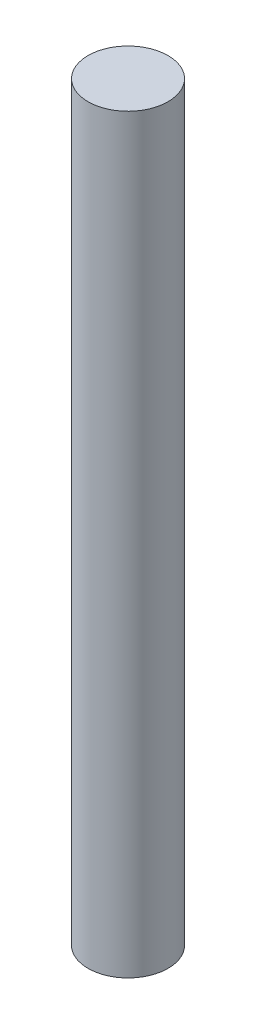
ISO-10303-21;
HEADER;
FILE_DESCRIPTION(('STEP AP214'),'2;1');
FILE_NAME('part.step','',(''),(''),'','','');
FILE_SCHEMA(('AUTOMOTIVE_DESIGN { 1 0 10303 214 1 1 1 1 }'));
ENDSEC;
DATA;
#1=APPLICATION_CONTEXT('core data for automotive mechanical design processes');
#2=APPLICATION_PROTOCOL_DEFINITION('international standard','automotive_design',2000,#1);
#3=PRODUCT_CONTEXT('',#1,'mechanical');
#4=PRODUCT('Part','Part','',(#3));
#5=PRODUCT_RELATED_PRODUCT_CATEGORY('part','',(#4));
#6=PRODUCT_DEFINITION_FORMATION('','',#4);
#7=PRODUCT_DEFINITION_CONTEXT('part definition',#1,'design');
#8=PRODUCT_DEFINITION('design','',#6,#7);
#9=PRODUCT_DEFINITION_SHAPE('','',#8);
#10=(LENGTH_UNIT() NAMED_UNIT(*) SI_UNIT(.MILLI.,.METRE.));
#11=(NAMED_UNIT(*) PLANE_ANGLE_UNIT() SI_UNIT($,.RADIAN.));
#12=(NAMED_UNIT(*) SI_UNIT($,.STERADIAN.) SOLID_ANGLE_UNIT());
#13=UNCERTAINTY_MEASURE_WITH_UNIT(LENGTH_MEASURE(1.E-05),#10,'distance_accuracy_value','');
#14=(GEOMETRIC_REPRESENTATION_CONTEXT(3) GLOBAL_UNCERTAINTY_ASSIGNED_CONTEXT((#13)) GLOBAL_UNIT_ASSIGNED_CONTEXT((#10,
#11,#12)) REPRESENTATION_CONTEXT('',''));
#15=CARTESIAN_POINT('',(0.,0.,0.));
#16=DIRECTION('',(0.,0.,1.));
#17=DIRECTION('',(1.,0.,0.));
#18=AXIS2_PLACEMENT_3D('',#15,#16,#17);
#19=CARTESIAN_POINT('',(0.,-7.6,0.));
#20=DIRECTION('',(0.,1.,0.));
#21=DIRECTION('',(0.,0.,1.));
#22=AXIS2_PLACEMENT_3D('',#19,#20,#21);
#23=PLANE('',#22);
#24=CARTESIAN_POINT('',(0.,-7.6,0.));
#25=DIRECTION('',(0.,-1.,0.));
#26=DIRECTION('',(0.,0.,-1.));
#27=AXIS2_PLACEMENT_3D('',#24,#25,#26);
#28=CIRCLE('',#27,0.405);
#29=CARTESIAN_POINT('',(0.,-7.6,-0.405));
#30=VERTEX_POINT('',#29);
#31=EDGE_CURVE('E17',#30,#30,#28,.F.);
#32=ORIENTED_EDGE('',*,*,#31,.F.);
#33=EDGE_LOOP('',(#32));
#34=FACE_BOUND('',#33,.T.);
#35=ADVANCED_FACE('F14',(#34),#23,.F.);
#36=CARTESIAN_POINT('',(0.,0.,0.));
#37=DIRECTION('',(0.,1.,0.));
#38=DIRECTION('',(0.,0.,1.));
#39=AXIS2_PLACEMENT_3D('',#36,#37,#38);
#40=PLANE('',#39);
#41=CARTESIAN_POINT('',(0.,0.,0.));
#42=DIRECTION('',(0.,-1.,0.));
#43=DIRECTION('',(0.,0.,-1.));
#44=AXIS2_PLACEMENT_3D('',#41,#42,#43);
#45=CIRCLE('',#44,0.405);
#46=CARTESIAN_POINT('',(0.,0.,-0.405));
#47=VERTEX_POINT('',#46);
#48=EDGE_CURVE('E9',#47,#47,#45,.T.);
#49=ORIENTED_EDGE('',*,*,#48,.F.);
#50=EDGE_LOOP('',(#49));
#51=FACE_BOUND('',#50,.T.);
#52=ADVANCED_FACE('F29',(#51),#40,.T.);
#53=CARTESIAN_POINT('',(0.,0.,0.));
#54=DIRECTION('',(0.,-1.,0.));
#55=DIRECTION('',(0.,0.,-1.));
#56=AXIS2_PLACEMENT_3D('',#53,#54,#55);
#57=CYLINDRICAL_SURFACE('',#56,0.405);
#58=ORIENTED_EDGE('',*,*,#48,.T.);
#59=EDGE_LOOP('',(#58));
#60=FACE_BOUND('',#59,.T.);
#61=ORIENTED_EDGE('',*,*,#31,.T.);
#62=EDGE_LOOP('',(#61));
#63=FACE_BOUND('',#62,.T.);
#64=ADVANCED_FACE('F26',(#60,#63),#57,.T.);
#65=CLOSED_SHELL('',(#35,#52,#64));
#66=MANIFOLD_SOLID_BREP('B1',#65);
#67=ADVANCED_BREP_SHAPE_REPRESENTATION('',(#18,#66),#14);
#68=SHAPE_DEFINITION_REPRESENTATION(#9,#67);
ENDSEC;
END-ISO-10303-21;
